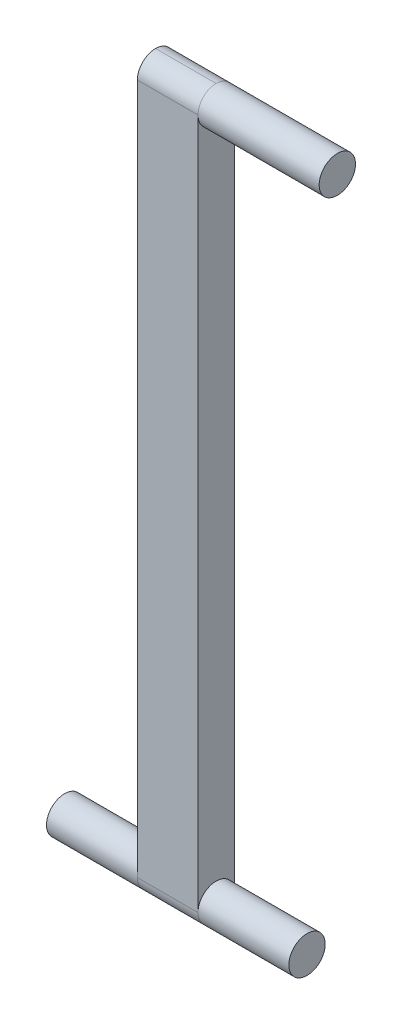
ISO-10303-21;
HEADER;
FILE_DESCRIPTION(('STEP AP214'),'2;1');
FILE_NAME('part.step','',(''),(''),'','','');
FILE_SCHEMA(('AUTOMOTIVE_DESIGN { 1 0 10303 214 1 1 1 1 }'));
ENDSEC;
DATA;
#1=APPLICATION_CONTEXT('core data for automotive mechanical design processes');
#2=APPLICATION_PROTOCOL_DEFINITION('international standard','automotive_design',2000,#1);
#3=PRODUCT_CONTEXT('',#1,'mechanical');
#4=PRODUCT('Part','Part','',(#3));
#5=PRODUCT_RELATED_PRODUCT_CATEGORY('part','',(#4));
#6=PRODUCT_DEFINITION_FORMATION('','',#4);
#7=PRODUCT_DEFINITION_CONTEXT('part definition',#1,'design');
#8=PRODUCT_DEFINITION('design','',#6,#7);
#9=PRODUCT_DEFINITION_SHAPE('','',#8);
#10=(LENGTH_UNIT() NAMED_UNIT(*) SI_UNIT(.MILLI.,.METRE.));
#11=(NAMED_UNIT(*) PLANE_ANGLE_UNIT() SI_UNIT($,.RADIAN.));
#12=(NAMED_UNIT(*) SI_UNIT($,.STERADIAN.) SOLID_ANGLE_UNIT());
#13=UNCERTAINTY_MEASURE_WITH_UNIT(LENGTH_MEASURE(1.E-05),#10,'distance_accuracy_value','');
#14=(GEOMETRIC_REPRESENTATION_CONTEXT(3) GLOBAL_UNCERTAINTY_ASSIGNED_CONTEXT((#13)) GLOBAL_UNIT_ASSIGNED_CONTEXT((#10,
#11,#12)) REPRESENTATION_CONTEXT('',''));
#15=CARTESIAN_POINT('',(0.,0.,0.));
#16=DIRECTION('',(0.,0.,1.));
#17=DIRECTION('',(1.,0.,0.));
#18=AXIS2_PLACEMENT_3D('',#15,#16,#17);
#19=CARTESIAN_POINT('',(2.5,30.,3.));
#20=DIRECTION('',(-1.,0.,0.));
#21=DIRECTION('',(0.,-1.,0.));
#22=AXIS2_PLACEMENT_3D('',#19,#20,#21);
#23=PLANE('',#22);
#24=DIRECTION('',(0.,1.,0.));
#25=VECTOR('',#24,1.);
#26=CARTESIAN_POINT('',(2.5,30.,3.));
#27=LINE('',#26,#25);
#28=CARTESIAN_POINT('',(2.5,-28.5,3.));
#29=VERTEX_POINT('',#28);
#30=CARTESIAN_POINT('',(2.5,28.5,3.));
#31=VERTEX_POINT('',#30);
#32=EDGE_CURVE('E107',#29,#31,#27,.T.);
#33=ORIENTED_EDGE('',*,*,#32,.F.);
#34=CARTESIAN_POINT('',(2.5,-28.5,1.5));
#35=DIRECTION('',(-1.,0.,0.));
#36=DIRECTION('',(0.,-1.,0.));
#37=AXIS2_PLACEMENT_3D('',#34,#35,#36);
#38=CIRCLE('',#37,1.5);
#39=CARTESIAN_POINT('',(2.5,-28.5,0.));
#40=VERTEX_POINT('',#39);
#41=EDGE_CURVE('E94',#29,#40,#38,.T.);
#42=ORIENTED_EDGE('',*,*,#41,.T.);
#43=DIRECTION('',(0.,1.,0.));
#44=VECTOR('',#43,1.);
#45=CARTESIAN_POINT('',(2.5,30.,0.));
#46=LINE('',#45,#44);
#47=CARTESIAN_POINT('',(2.5,28.5,0.));
#48=VERTEX_POINT('',#47);
#49=EDGE_CURVE('E105',#40,#48,#46,.T.);
#50=ORIENTED_EDGE('',*,*,#49,.T.);
#51=CARTESIAN_POINT('',(2.5,28.5,1.5));
#52=DIRECTION('',(1.,0.,0.));
#53=DIRECTION('',(0.,1.,0.));
#54=AXIS2_PLACEMENT_3D('',#51,#52,#53);
#55=CIRCLE('',#54,1.5);
#56=EDGE_CURVE('E168',#31,#48,#55,.T.);
#57=ORIENTED_EDGE('',*,*,#56,.F.);
#58=EDGE_LOOP('',(#33,#42,#50,#57));
#59=FACE_BOUND('',#58,.T.);
#60=ADVANCED_FACE('F39',(#59),#23,.F.);
#61=CARTESIAN_POINT('',(-2.5,30.,3.));
#62=DIRECTION('',(1.,0.,0.));
#63=DIRECTION('',(0.,1.,0.));
#64=AXIS2_PLACEMENT_3D('',#61,#62,#63);
#65=PLANE('',#64);
#66=DIRECTION('',(0.,-1.,0.));
#67=VECTOR('',#66,1.);
#68=CARTESIAN_POINT('',(-2.5,30.,0.));
#69=LINE('',#68,#67);
#70=CARTESIAN_POINT('',(-2.5,28.5,0.));
#71=VERTEX_POINT('',#70);
#72=CARTESIAN_POINT('',(-2.5,-28.5,0.));
#73=VERTEX_POINT('',#72);
#74=EDGE_CURVE('E119',#71,#73,#69,.T.);
#75=ORIENTED_EDGE('',*,*,#74,.T.);
#76=CARTESIAN_POINT('',(-2.5,-28.5,1.5));
#77=DIRECTION('',(1.,0.,0.));
#78=DIRECTION('',(0.,1.,0.));
#79=AXIS2_PLACEMENT_3D('',#76,#77,#78);
#80=CIRCLE('',#79,1.5);
#81=CARTESIAN_POINT('',(-2.5,-28.5,3.));
#82=VERTEX_POINT('',#81);
#83=EDGE_CURVE('E124',#73,#82,#80,.T.);
#84=ORIENTED_EDGE('',*,*,#83,.T.);
#85=DIRECTION('',(0.,-1.,0.));
#86=VECTOR('',#85,1.);
#87=CARTESIAN_POINT('',(-2.5,30.,3.));
#88=LINE('',#87,#86);
#89=CARTESIAN_POINT('',(-2.5,28.5,3.));
#90=VERTEX_POINT('',#89);
#91=EDGE_CURVE('E118',#90,#82,#88,.T.);
#92=ORIENTED_EDGE('',*,*,#91,.F.);
#93=CARTESIAN_POINT('',(-2.5,28.5,1.5));
#94=DIRECTION('',(1.,0.,0.));
#95=DIRECTION('',(0.,1.,0.));
#96=AXIS2_PLACEMENT_3D('',#93,#94,#95);
#97=CIRCLE('',#96,1.5);
#98=CARTESIAN_POINT('',(-2.5,30.,1.5));
#99=VERTEX_POINT('',#98);
#100=EDGE_CURVE('E153',#90,#99,#97,.F.);
#101=ORIENTED_EDGE('',*,*,#100,.T.);
#102=CARTESIAN_POINT('',(-2.5,28.5,1.5));
#103=DIRECTION('',(1.,0.,0.));
#104=DIRECTION('',(0.,1.,0.));
#105=AXIS2_PLACEMENT_3D('',#102,#103,#104);
#106=CIRCLE('',#105,1.5);
#107=EDGE_CURVE('E162',#99,#71,#106,.F.);
#108=ORIENTED_EDGE('',*,*,#107,.T.);
#109=EDGE_LOOP('',(#75,#84,#92,#101,#108));
#110=FACE_BOUND('',#109,.T.);
#111=ADVANCED_FACE('F198',(#110),#65,.F.);
#112=CARTESIAN_POINT('',(0.,0.,3.));
#113=DIRECTION('',(0.,0.,-1.));
#114=DIRECTION('',(-1.,0.,0.));
#115=AXIS2_PLACEMENT_3D('',#112,#113,#114);
#116=PLANE('',#115);
#117=ORIENTED_EDGE('',*,*,#91,.T.);
#118=DIRECTION('',(1.,0.,0.));
#119=VECTOR('',#118,1.);
#120=CARTESIAN_POINT('',(0.,-28.5,3.));
#121=LINE('',#120,#119);
#122=EDGE_CURVE('E49',#82,#29,#121,.T.);
#123=ORIENTED_EDGE('',*,*,#122,.T.);
#124=ORIENTED_EDGE('',*,*,#32,.T.);
#125=DIRECTION('',(-1.,0.,0.));
#126=VECTOR('',#125,1.);
#127=CARTESIAN_POINT('',(0.,28.5,3.));
#128=LINE('',#127,#126);
#129=EDGE_CURVE('E165',#31,#90,#128,.T.);
#130=ORIENTED_EDGE('',*,*,#129,.T.);
#131=EDGE_LOOP('',(#117,#123,#124,#130));
#132=FACE_BOUND('',#131,.T.);
#133=ADVANCED_FACE('F197',(#132),#116,.F.);
#134=CARTESIAN_POINT('',(0.,0.,0.));
#135=DIRECTION('',(0.,0.,-1.));
#136=DIRECTION('',(-1.,0.,0.));
#137=AXIS2_PLACEMENT_3D('',#134,#135,#136);
#138=PLANE('',#137);
#139=ORIENTED_EDGE('',*,*,#49,.F.);
#140=DIRECTION('',(1.,0.,0.));
#141=VECTOR('',#140,1.);
#142=CARTESIAN_POINT('',(-2.5,-28.5,0.));
#143=LINE('',#142,#141);
#144=EDGE_CURVE('E11',#40,#73,#143,.F.);
#145=ORIENTED_EDGE('',*,*,#144,.T.);
#146=ORIENTED_EDGE('',*,*,#74,.F.);
#147=DIRECTION('',(-1.,0.,0.));
#148=VECTOR('',#147,1.);
#149=CARTESIAN_POINT('',(2.5,28.5,0.));
#150=LINE('',#149,#148);
#151=EDGE_CURVE('E115',#71,#48,#150,.F.);
#152=ORIENTED_EDGE('',*,*,#151,.T.);
#153=EDGE_LOOP('',(#139,#145,#146,#152));
#154=FACE_BOUND('',#153,.T.);
#155=ADVANCED_FACE('F112',(#154),#138,.T.);
#156=CARTESIAN_POINT('',(12.5,28.5,1.5));
#157=DIRECTION('',(-1.,0.,0.));
#158=DIRECTION('',(0.,-1.,0.));
#159=AXIS2_PLACEMENT_3D('',#156,#157,#158);
#160=CYLINDRICAL_SURFACE('',#159,1.5);
#161=CARTESIAN_POINT('',(12.5,28.5,1.5));
#162=DIRECTION('',(1.,0.,0.));
#163=DIRECTION('',(0.,1.,0.));
#164=AXIS2_PLACEMENT_3D('',#161,#162,#163);
#165=CIRCLE('',#164,1.5);
#166=CARTESIAN_POINT('',(12.5,30.,1.5));
#167=VERTEX_POINT('',#166);
#168=EDGE_CURVE('E172',#167,#167,#165,.T.);
#169=ORIENTED_EDGE('',*,*,#168,.F.);
#170=EDGE_LOOP('',(#169));
#171=FACE_BOUND('',#170,.T.);
#172=CARTESIAN_POINT('',(2.5,30.,1.5));
#173=VERTEX_POINT('',#172);
#174=EDGE_CURVE('E158',#173,#31,#55,.T.);
#175=ORIENTED_EDGE('',*,*,#174,.T.);
#176=ORIENTED_EDGE('',*,*,#56,.T.);
#177=EDGE_CURVE('E175',#48,#173,#55,.T.);
#178=ORIENTED_EDGE('',*,*,#177,.T.);
#179=EDGE_LOOP('',(#175,#176,#178));
#180=FACE_BOUND('',#179,.T.);
#181=ADVANCED_FACE('F187',(#171,#180),#160,.T.);
#182=CARTESIAN_POINT('',(12.5,28.5,1.5));
#183=DIRECTION('',(1.,0.,0.));
#184=DIRECTION('',(0.,1.,0.));
#185=AXIS2_PLACEMENT_3D('',#182,#183,#184);
#186=PLANE('',#185);
#187=ORIENTED_EDGE('',*,*,#168,.T.);
#188=EDGE_LOOP('',(#187));
#189=FACE_BOUND('',#188,.T.);
#190=ADVANCED_FACE('F185',(#189),#186,.T.);
#191=CARTESIAN_POINT('',(2.5,28.5,1.5));
#192=DIRECTION('',(1.,0.,0.));
#193=DIRECTION('',(0.,0.,-1.));
#194=AXIS2_PLACEMENT_3D('',#191,#192,#193);
#195=CYLINDRICAL_SURFACE('',#194,1.5);
#196=DIRECTION('',(-1.,0.,0.));
#197=VECTOR('',#196,1.);
#198=CARTESIAN_POINT('',(-2.5,30.,1.5));
#199=LINE('',#198,#197);
#200=EDGE_CURVE('E109',#173,#99,#199,.T.);
#201=ORIENTED_EDGE('',*,*,#200,.F.);
#202=ORIENTED_EDGE('',*,*,#177,.F.);
#203=ORIENTED_EDGE('',*,*,#151,.F.);
#204=ORIENTED_EDGE('',*,*,#107,.F.);
#205=EDGE_LOOP('',(#201,#202,#203,#204));
#206=FACE_BOUND('',#205,.T.);
#207=ADVANCED_FACE('F201',(#206),#195,.T.);
#208=CARTESIAN_POINT('',(0.,28.5,1.5));
#209=DIRECTION('',(-1.,0.,0.));
#210=DIRECTION('',(0.,0.,1.));
#211=AXIS2_PLACEMENT_3D('',#208,#209,#210);
#212=CYLINDRICAL_SURFACE('',#211,1.5);
#213=ORIENTED_EDGE('',*,*,#174,.F.);
#214=ORIENTED_EDGE('',*,*,#200,.T.);
#215=ORIENTED_EDGE('',*,*,#100,.F.);
#216=ORIENTED_EDGE('',*,*,#129,.F.);
#217=EDGE_LOOP('',(#213,#214,#215,#216));
#218=FACE_BOUND('',#217,.T.);
#219=ADVANCED_FACE('F196',(#218),#212,.T.);
#220=CARTESIAN_POINT('',(-10.,-28.5,1.5));
#221=DIRECTION('',(-1.,0.,0.));
#222=DIRECTION('',(0.,-1.,0.));
#223=AXIS2_PLACEMENT_3D('',#220,#221,#222);
#224=PLANE('',#223);
#225=CARTESIAN_POINT('',(-10.,-28.5,1.5));
#226=DIRECTION('',(-1.,0.,0.));
#227=DIRECTION('',(0.,-1.,0.));
#228=AXIS2_PLACEMENT_3D('',#225,#226,#227);
#229=CIRCLE('',#228,1.5);
#230=CARTESIAN_POINT('',(-10.,-30.,1.5));
#231=VERTEX_POINT('',#230);
#232=EDGE_CURVE('E136',#231,#231,#229,.T.);
#233=ORIENTED_EDGE('',*,*,#232,.T.);
#234=EDGE_LOOP('',(#233));
#235=FACE_BOUND('',#234,.T.);
#236=ADVANCED_FACE('F210',(#235),#224,.T.);
#237=CARTESIAN_POINT('',(10.,-28.5,1.5));
#238=DIRECTION('',(-1.,0.,0.));
#239=DIRECTION('',(0.,-1.,0.));
#240=AXIS2_PLACEMENT_3D('',#237,#238,#239);
#241=CYLINDRICAL_SURFACE('',#240,1.5);
#242=ORIENTED_EDGE('',*,*,#232,.F.);
#243=EDGE_LOOP('',(#242));
#244=FACE_BOUND('',#243,.T.);
#245=CARTESIAN_POINT('',(-2.5,-30.,1.5));
#246=VERTEX_POINT('',#245);
#247=EDGE_CURVE('E110',#246,#73,#80,.T.);
#248=ORIENTED_EDGE('',*,*,#247,.F.);
#249=EDGE_CURVE('E64',#82,#246,#80,.T.);
#250=ORIENTED_EDGE('',*,*,#249,.F.);
#251=ORIENTED_EDGE('',*,*,#83,.F.);
#252=EDGE_LOOP('',(#248,#250,#251));
#253=FACE_BOUND('',#252,.T.);
#254=ADVANCED_FACE('F227',(#244,#253),#241,.T.);
#255=CARTESIAN_POINT('',(10.,-28.5,1.5));
#256=DIRECTION('',(-1.,0.,0.));
#257=DIRECTION('',(0.,-1.,0.));
#258=AXIS2_PLACEMENT_3D('',#255,#256,#257);
#259=CIRCLE('',#258,1.5);
#260=CARTESIAN_POINT('',(10.,-30.,1.5));
#261=VERTEX_POINT('',#260);
#262=EDGE_CURVE('E129',#261,#261,#259,.T.);
#263=ORIENTED_EDGE('',*,*,#262,.T.);
#264=EDGE_LOOP('',(#263));
#265=FACE_BOUND('',#264,.T.);
#266=ORIENTED_EDGE('',*,*,#41,.F.);
#267=CARTESIAN_POINT('',(2.5,-30.,1.5));
#268=VERTEX_POINT('',#267);
#269=EDGE_CURVE('E56',#268,#29,#38,.T.);
#270=ORIENTED_EDGE('',*,*,#269,.F.);
#271=EDGE_CURVE('E91',#40,#268,#38,.T.);
#272=ORIENTED_EDGE('',*,*,#271,.F.);
#273=EDGE_LOOP('',(#266,#270,#272));
#274=FACE_BOUND('',#273,.T.);
#275=ADVANCED_FACE('F93',(#265,#274),#241,.T.);
#276=CARTESIAN_POINT('',(10.,-28.5,1.5));
#277=DIRECTION('',(-1.,0.,0.));
#278=DIRECTION('',(0.,-1.,0.));
#279=AXIS2_PLACEMENT_3D('',#276,#277,#278);
#280=PLANE('',#279);
#281=ORIENTED_EDGE('',*,*,#262,.F.);
#282=EDGE_LOOP('',(#281));
#283=FACE_BOUND('',#282,.T.);
#284=ADVANCED_FACE('F226',(#283),#280,.F.);
#285=CARTESIAN_POINT('',(2.5,-28.5,1.5));
#286=DIRECTION('',(-1.,0.,0.));
#287=DIRECTION('',(0.,0.,1.));
#288=AXIS2_PLACEMENT_3D('',#285,#286,#287);
#289=CYLINDRICAL_SURFACE('',#288,1.5);
#290=DIRECTION('',(1.,0.,0.));
#291=VECTOR('',#290,1.);
#292=CARTESIAN_POINT('',(2.5,-30.,1.5));
#293=LINE('',#292,#291);
#294=EDGE_CURVE('E43',#246,#268,#293,.T.);
#295=ORIENTED_EDGE('',*,*,#294,.F.);
#296=ORIENTED_EDGE('',*,*,#247,.T.);
#297=ORIENTED_EDGE('',*,*,#144,.F.);
#298=ORIENTED_EDGE('',*,*,#271,.T.);
#299=EDGE_LOOP('',(#295,#296,#297,#298));
#300=FACE_BOUND('',#299,.T.);
#301=ADVANCED_FACE('F41',(#300),#289,.T.);
#302=CARTESIAN_POINT('',(0.,-28.5,1.5));
#303=DIRECTION('',(1.,0.,0.));
#304=DIRECTION('',(0.,0.,-1.));
#305=AXIS2_PLACEMENT_3D('',#302,#303,#304);
#306=CYLINDRICAL_SURFACE('',#305,1.5);
#307=ORIENTED_EDGE('',*,*,#249,.T.);
#308=ORIENTED_EDGE('',*,*,#294,.T.);
#309=ORIENTED_EDGE('',*,*,#269,.T.);
#310=ORIENTED_EDGE('',*,*,#122,.F.);
#311=EDGE_LOOP('',(#307,#308,#309,#310));
#312=FACE_BOUND('',#311,.T.);
#313=ADVANCED_FACE('F146',(#312),#306,.T.);
#314=CLOSED_SHELL('',(#60,#111,#133,#155,#181,#190,#207,#219,#236,#254,#275,#284,#301,#313));
#315=MANIFOLD_SOLID_BREP('B2',#314);
#316=ADVANCED_BREP_SHAPE_REPRESENTATION('',(#18,#315),#14);
#317=SHAPE_DEFINITION_REPRESENTATION(#9,#316);
ENDSEC;
END-ISO-10303-21;
